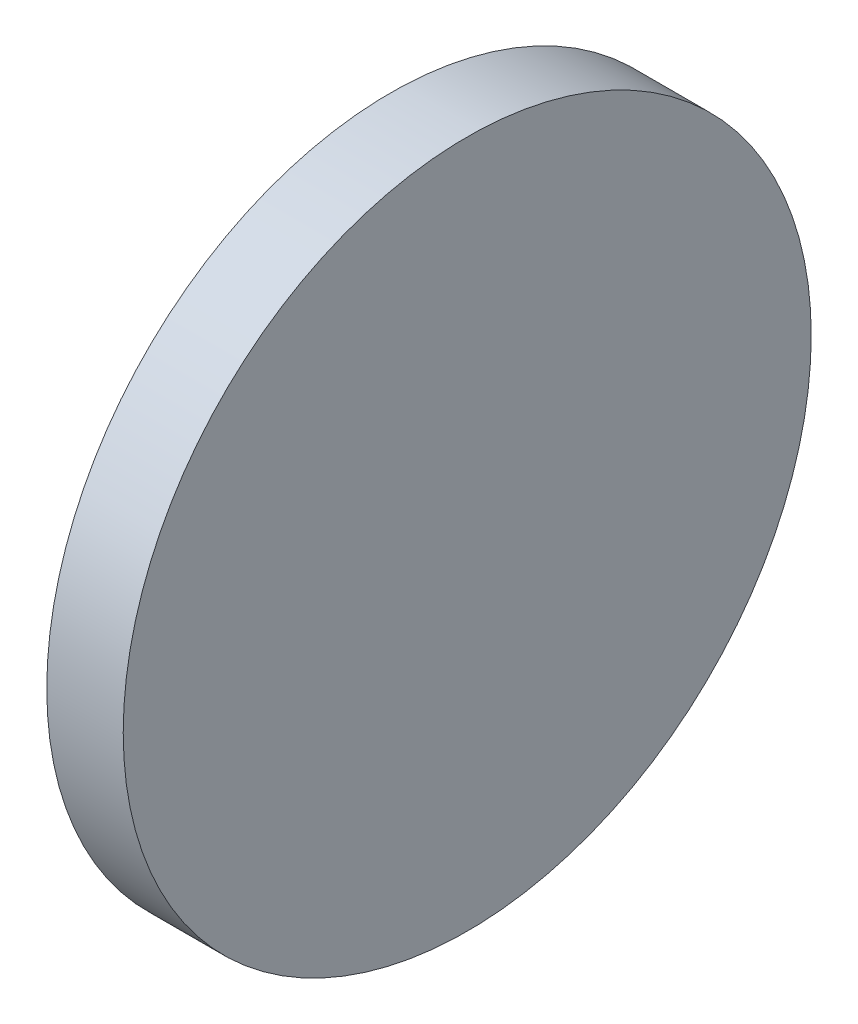
ISO-10303-21;
HEADER;
FILE_DESCRIPTION(('STEP AP214'),'2;1');
FILE_NAME('part.step','',(''),(''),'','','');
FILE_SCHEMA(('AUTOMOTIVE_DESIGN { 1 0 10303 214 1 1 1 1 }'));
ENDSEC;
DATA;
#1=APPLICATION_CONTEXT('core data for automotive mechanical design processes');
#2=APPLICATION_PROTOCOL_DEFINITION('international standard','automotive_design',2000,#1);
#3=PRODUCT_CONTEXT('',#1,'mechanical');
#4=PRODUCT('Part','Part','',(#3));
#5=PRODUCT_RELATED_PRODUCT_CATEGORY('part','',(#4));
#6=PRODUCT_DEFINITION_FORMATION('','',#4);
#7=PRODUCT_DEFINITION_CONTEXT('part definition',#1,'design');
#8=PRODUCT_DEFINITION('design','',#6,#7);
#9=PRODUCT_DEFINITION_SHAPE('','',#8);
#10=(LENGTH_UNIT() NAMED_UNIT(*) SI_UNIT(.MILLI.,.METRE.));
#11=(NAMED_UNIT(*) PLANE_ANGLE_UNIT() SI_UNIT($,.RADIAN.));
#12=(NAMED_UNIT(*) SI_UNIT($,.STERADIAN.) SOLID_ANGLE_UNIT());
#13=UNCERTAINTY_MEASURE_WITH_UNIT(LENGTH_MEASURE(1.E-05),#10,'distance_accuracy_value','');
#14=(GEOMETRIC_REPRESENTATION_CONTEXT(3) GLOBAL_UNCERTAINTY_ASSIGNED_CONTEXT((#13)) GLOBAL_UNIT_ASSIGNED_CONTEXT((#10,
#11,#12)) REPRESENTATION_CONTEXT('',''));
#15=CARTESIAN_POINT('',(0.,0.,0.));
#16=DIRECTION('',(0.,0.,1.));
#17=DIRECTION('',(1.,0.,0.));
#18=AXIS2_PLACEMENT_3D('',#15,#16,#17);
#19=CARTESIAN_POINT('',(5.,0.,0.));
#20=DIRECTION('',(-1.,0.,0.));
#21=DIRECTION('',(0.,0.,1.));
#22=AXIS2_PLACEMENT_3D('',#19,#20,#21);
#23=CYLINDRICAL_SURFACE('',#22,22.5);
#24=CARTESIAN_POINT('',(5.,0.,0.));
#25=DIRECTION('',(1.,0.,0.));
#26=DIRECTION('',(0.,0.,-1.));
#27=AXIS2_PLACEMENT_3D('',#24,#25,#26);
#28=CIRCLE('',#27,22.5);
#29=CARTESIAN_POINT('',(5.,0.,-22.5));
#30=VERTEX_POINT('',#29);
#31=EDGE_CURVE('E10',#30,#30,#28,.T.);
#32=ORIENTED_EDGE('',*,*,#31,.F.);
#33=EDGE_LOOP('',(#32));
#34=FACE_BOUND('',#33,.T.);
#35=CARTESIAN_POINT('',(0.,0.,0.));
#36=DIRECTION('',(1.,0.,0.));
#37=DIRECTION('',(0.,0.,-1.));
#38=AXIS2_PLACEMENT_3D('',#35,#36,#37);
#39=CIRCLE('',#38,22.5);
#40=CARTESIAN_POINT('',(0.,0.,-22.5));
#41=VERTEX_POINT('',#40);
#42=EDGE_CURVE('E38',#41,#41,#39,.T.);
#43=ORIENTED_EDGE('',*,*,#42,.T.);
#44=EDGE_LOOP('',(#43));
#45=FACE_BOUND('',#44,.T.);
#46=ADVANCED_FACE('F35',(#34,#45),#23,.T.);
#47=CARTESIAN_POINT('',(5.,0.,0.));
#48=DIRECTION('',(1.,0.,0.));
#49=DIRECTION('',(0.,0.,-1.));
#50=AXIS2_PLACEMENT_3D('',#47,#48,#49);
#51=PLANE('',#50);
#52=ORIENTED_EDGE('',*,*,#31,.T.);
#53=EDGE_LOOP('',(#52));
#54=FACE_BOUND('',#53,.T.);
#55=ADVANCED_FACE('F50',(#54),#51,.T.);
#56=CARTESIAN_POINT('',(0.,0.,0.));
#57=DIRECTION('',(1.,0.,0.));
#58=DIRECTION('',(0.,0.,-1.));
#59=AXIS2_PLACEMENT_3D('',#56,#57,#58);
#60=PLANE('',#59);
#61=ORIENTED_EDGE('',*,*,#42,.F.);
#62=EDGE_LOOP('',(#61));
#63=FACE_BOUND('',#62,.T.);
#64=ADVANCED_FACE('F48',(#63),#60,.F.);
#65=CLOSED_SHELL('',(#46,#55,#64));
#66=MANIFOLD_SOLID_BREP('B2',#65);
#67=ADVANCED_BREP_SHAPE_REPRESENTATION('',(#18,#66),#14);
#68=SHAPE_DEFINITION_REPRESENTATION(#9,#67);
ENDSEC;
END-ISO-10303-21;
